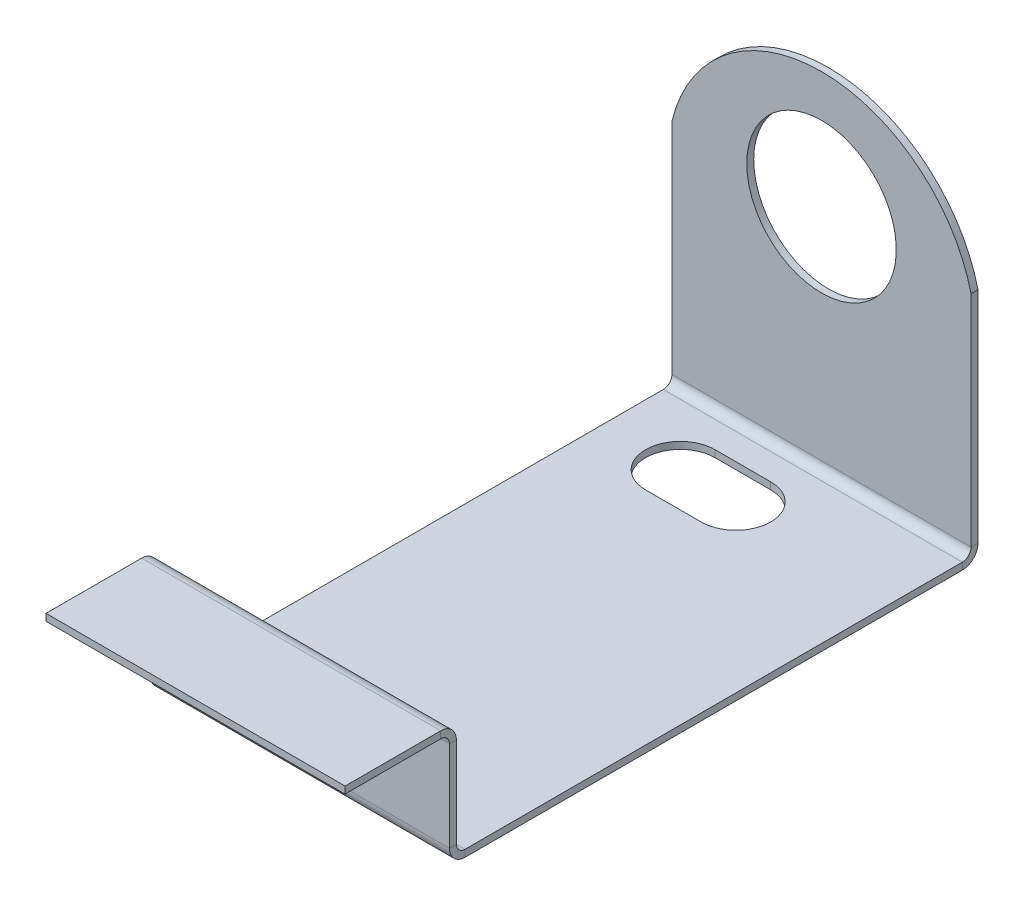
ISO-10303-21;
HEADER;
FILE_DESCRIPTION(('STEP AP214'),'2;1');
FILE_NAME('part.step','',(''),(''),'','','');
FILE_SCHEMA(('AUTOMOTIVE_DESIGN { 1 0 10303 214 1 1 1 1 }'));
ENDSEC;
DATA;
#1=APPLICATION_CONTEXT('core data for automotive mechanical design processes');
#2=APPLICATION_PROTOCOL_DEFINITION('international standard','automotive_design',2000,#1);
#3=PRODUCT_CONTEXT('',#1,'mechanical');
#4=PRODUCT('Part','Part','',(#3));
#5=PRODUCT_RELATED_PRODUCT_CATEGORY('part','',(#4));
#6=PRODUCT_DEFINITION_FORMATION('','',#4);
#7=PRODUCT_DEFINITION_CONTEXT('part definition',#1,'design');
#8=PRODUCT_DEFINITION('design','',#6,#7);
#9=PRODUCT_DEFINITION_SHAPE('','',#8);
#10=(LENGTH_UNIT() NAMED_UNIT(*) SI_UNIT(.MILLI.,.METRE.));
#11=(NAMED_UNIT(*) PLANE_ANGLE_UNIT() SI_UNIT($,.RADIAN.));
#12=(NAMED_UNIT(*) SI_UNIT($,.STERADIAN.) SOLID_ANGLE_UNIT());
#13=UNCERTAINTY_MEASURE_WITH_UNIT(LENGTH_MEASURE(1.E-05),#10,'distance_accuracy_value','');
#14=(GEOMETRIC_REPRESENTATION_CONTEXT(3) GLOBAL_UNCERTAINTY_ASSIGNED_CONTEXT((#13)) GLOBAL_UNIT_ASSIGNED_CONTEXT((#10,
#11,#12)) REPRESENTATION_CONTEXT('',''));
#15=CARTESIAN_POINT('',(0.,0.,0.));
#16=DIRECTION('',(0.,0.,1.));
#17=DIRECTION('',(1.,0.,0.));
#18=AXIS2_PLACEMENT_3D('',#15,#16,#17);
#19=CARTESIAN_POINT('',(86.,-148.497787143782,-31.9999999999995));
#20=DIRECTION('',(-1.,0.,0.));
#21=DIRECTION('',(0.,1.,0.));
#22=AXIS2_PLACEMENT_3D('',#19,#20,#21);
#23=PLANE('',#22);
#24=DIRECTION('',(0.,1.,0.));
#25=VECTOR('',#24,1.);
#26=CARTESIAN_POINT('',(86.,-148.497787143782,-31.9999999999995));
#27=LINE('',#26,#25);
#28=CARTESIAN_POINT('',(86.,2.49999999999999,-32.));
#29=VERTEX_POINT('',#28);
#30=CARTESIAN_POINT('',(86.,28.5000000000001,-32.0000000000001));
#31=VERTEX_POINT('',#30);
#32=EDGE_CURVE('E372',#29,#31,#27,.T.);
#33=ORIENTED_EDGE('',*,*,#32,.T.);
#34=DIRECTION('',(0.,0.,1.));
#35=VECTOR('',#34,1.);
#36=CARTESIAN_POINT('',(86.,28.5000000000001,-32.0000000000002));
#37=LINE('',#36,#35);
#38=CARTESIAN_POINT('',(86.,28.5,-30.0000000000001));
#39=VERTEX_POINT('',#38);
#40=EDGE_CURVE('E12',#31,#39,#37,.T.);
#41=ORIENTED_EDGE('',*,*,#40,.T.);
#42=DIRECTION('',(0.,1.,0.));
#43=VECTOR('',#42,1.);
#44=CARTESIAN_POINT('',(86.,-148.497787143782,-29.9999999999995));
#45=LINE('',#44,#43);
#46=CARTESIAN_POINT('',(86.,2.50000000000002,-30.));
#47=VERTEX_POINT('',#46);
#48=EDGE_CURVE('E271',#47,#39,#45,.T.);
#49=ORIENTED_EDGE('',*,*,#48,.F.);
#50=DIRECTION('',(0.,0.,1.));
#51=VECTOR('',#50,1.);
#52=CARTESIAN_POINT('',(86.,2.50000000000006,-32.0000000000001));
#53=LINE('',#52,#51);
#54=EDGE_CURVE('E355',#29,#47,#53,.T.);
#55=ORIENTED_EDGE('',*,*,#54,.F.);
#56=EDGE_LOOP('',(#33,#41,#49,#55));
#57=FACE_BOUND('',#56,.T.);
#58=ADVANCED_FACE('F37',(#57),#23,.F.);
#59=CARTESIAN_POINT('',(0.,-148.497787143782,-31.9999999999995));
#60=DIRECTION('',(0.,0.,1.));
#61=DIRECTION('',(0.,-1.,0.));
#62=AXIS2_PLACEMENT_3D('',#59,#60,#61);
#63=PLANE('',#62);
#64=DIRECTION('',(0.,1.,0.));
#65=VECTOR('',#64,1.);
#66=CARTESIAN_POINT('',(0.,-148.497787143782,-31.9999999999995));
#67=LINE('',#66,#65);
#68=CARTESIAN_POINT('',(0.,2.50000000000001,-32.));
#69=VERTEX_POINT('',#68);
#70=CARTESIAN_POINT('',(0.,28.5000000000001,-32.0000000000001));
#71=VERTEX_POINT('',#70);
#72=EDGE_CURVE('E40',#69,#71,#67,.T.);
#73=ORIENTED_EDGE('',*,*,#72,.T.);
#74=DIRECTION('',(1.,0.,0.));
#75=VECTOR('',#74,1.);
#76=CARTESIAN_POINT('',(0.,28.5000000000001,-32.0000000000001));
#77=LINE('',#76,#75);
#78=EDGE_CURVE('E365',#71,#31,#77,.T.);
#79=ORIENTED_EDGE('',*,*,#78,.T.);
#80=ORIENTED_EDGE('',*,*,#32,.F.);
#81=DIRECTION('',(1.,0.,0.));
#82=VECTOR('',#81,1.);
#83=CARTESIAN_POINT('',(0.,2.50000000000006,-32.));
#84=LINE('',#83,#82);
#85=EDGE_CURVE('E352',#69,#29,#84,.T.);
#86=ORIENTED_EDGE('',*,*,#85,.F.);
#87=EDGE_LOOP('',(#73,#79,#80,#86));
#88=FACE_BOUND('',#87,.T.);
#89=ADVANCED_FACE('F383',(#88),#63,.F.);
#90=CARTESIAN_POINT('',(0.,-148.497787143782,-29.9999999999995));
#91=DIRECTION('',(1.,0.,0.));
#92=DIRECTION('',(0.,-1.,0.));
#93=AXIS2_PLACEMENT_3D('',#90,#91,#92);
#94=PLANE('',#93);
#95=DIRECTION('',(0.,1.,0.));
#96=VECTOR('',#95,1.);
#97=CARTESIAN_POINT('',(0.,-148.497787143782,-29.9999999999995));
#98=LINE('',#97,#96);
#99=CARTESIAN_POINT('',(0.,2.50000000000002,-30.));
#100=VERTEX_POINT('',#99);
#101=CARTESIAN_POINT('',(0.,28.5000000000001,-30.0000000000001));
#102=VERTEX_POINT('',#101);
#103=EDGE_CURVE('E356',#100,#102,#98,.T.);
#104=ORIENTED_EDGE('',*,*,#103,.T.);
#105=DIRECTION('',(0.,0.,-1.));
#106=VECTOR('',#105,1.);
#107=CARTESIAN_POINT('',(0.,28.5000000000001,-30.0000000000002));
#108=LINE('',#107,#106);
#109=EDGE_CURVE('E368',#102,#71,#108,.T.);
#110=ORIENTED_EDGE('',*,*,#109,.T.);
#111=ORIENTED_EDGE('',*,*,#72,.F.);
#112=DIRECTION('',(0.,0.,-1.));
#113=VECTOR('',#112,1.);
#114=CARTESIAN_POINT('',(0.,2.50000000000007,-30.0000000000001));
#115=LINE('',#114,#113);
#116=EDGE_CURVE('E362',#100,#69,#115,.T.);
#117=ORIENTED_EDGE('',*,*,#116,.F.);
#118=EDGE_LOOP('',(#104,#110,#111,#117));
#119=FACE_BOUND('',#118,.T.);
#120=ADVANCED_FACE('F386',(#119),#94,.F.);
#121=CARTESIAN_POINT('',(0.,-148.497787143782,-29.9999999999995));
#122=DIRECTION('',(0.,0.,1.));
#123=DIRECTION('',(0.,-1.,0.));
#124=AXIS2_PLACEMENT_3D('',#121,#122,#123);
#125=PLANE('',#124);
#126=DIRECTION('',(1.,0.,0.));
#127=VECTOR('',#126,1.);
#128=CARTESIAN_POINT('',(0.,28.5000000000001,-30.0000000000001));
#129=LINE('',#128,#127);
#130=EDGE_CURVE('E45',#102,#39,#129,.T.);
#131=ORIENTED_EDGE('',*,*,#130,.F.);
#132=ORIENTED_EDGE('',*,*,#103,.F.);
#133=DIRECTION('',(1.,0.,0.));
#134=VECTOR('',#133,1.);
#135=CARTESIAN_POINT('',(0.,2.50000000000007,-30.));
#136=LINE('',#135,#134);
#137=EDGE_CURVE('E359',#100,#47,#136,.T.);
#138=ORIENTED_EDGE('',*,*,#137,.T.);
#139=ORIENTED_EDGE('',*,*,#48,.T.);
#140=EDGE_LOOP('',(#131,#132,#138,#139));
#141=FACE_BOUND('',#140,.T.);
#142=ADVANCED_FACE('F454',(#141),#125,.T.);
#143=CARTESIAN_POINT('',(43.,55.1788366009013,-180.));
#144=DIRECTION('',(0.,0.,-1.));
#145=DIRECTION('',(-1.,0.,0.));
#146=AXIS2_PLACEMENT_3D('',#143,#144,#145);
#147=CYLINDRICAL_SURFACE('',#146,44.2489583618449);
#148=DIRECTION('',(0.,0.,1.));
#149=VECTOR('',#148,1.);
#150=CARTESIAN_POINT('',(0.,65.6177214124262,-180.));
#151=LINE('',#150,#149);
#152=CARTESIAN_POINT('',(0.,65.6177214124262,-180.));
#153=VERTEX_POINT('',#152);
#154=CARTESIAN_POINT('',(0.,65.6177214124262,-182.));
#155=VERTEX_POINT('',#154);
#156=EDGE_CURVE('E341',#153,#155,#151,.F.);
#157=ORIENTED_EDGE('',*,*,#156,.F.);
#158=CARTESIAN_POINT('',(43.,55.1788366009013,-180.));
#159=DIRECTION('',(0.,0.,-1.));
#160=DIRECTION('',(-1.,0.,0.));
#161=AXIS2_PLACEMENT_3D('',#158,#159,#160);
#162=CIRCLE('',#161,44.2489583618449);
#163=CARTESIAN_POINT('',(86.,65.6177214124262,-180.));
#164=VERTEX_POINT('',#163);
#165=EDGE_CURVE('E324',#164,#153,#162,.F.);
#166=ORIENTED_EDGE('',*,*,#165,.F.);
#167=DIRECTION('',(0.,0.,1.));
#168=VECTOR('',#167,1.);
#169=CARTESIAN_POINT('',(86.,65.6177214124262,-180.));
#170=LINE('',#169,#168);
#171=CARTESIAN_POINT('',(86.,65.6177214124262,-182.));
#172=VERTEX_POINT('',#171);
#173=EDGE_CURVE('E349',#164,#172,#170,.F.);
#174=ORIENTED_EDGE('',*,*,#173,.T.);
#175=CARTESIAN_POINT('',(43.,55.1788366009013,-182.));
#176=DIRECTION('',(0.,0.,-1.));
#177=DIRECTION('',(-1.,0.,0.));
#178=AXIS2_PLACEMENT_3D('',#175,#176,#177);
#179=CIRCLE('',#178,44.2489583618449);
#180=EDGE_CURVE('E347',#172,#155,#179,.F.);
#181=ORIENTED_EDGE('',*,*,#180,.T.);
#182=EDGE_LOOP('',(#157,#166,#174,#181));
#183=FACE_BOUND('',#182,.T.);
#184=ADVANCED_FACE('F456',(#183),#147,.T.);
#185=CARTESIAN_POINT('',(43.0084201572259,65.7834199573394,-172.));
#186=DIRECTION('',(0.,0.,-1.));
#187=DIRECTION('',(-1.,0.,0.));
#188=AXIS2_PLACEMENT_3D('',#185,#186,#187);
#189=CYLINDRICAL_SURFACE('',#188,21.5);
#190=CARTESIAN_POINT('',(43.0084201572259,65.7834199573394,-182.));
#191=DIRECTION('',(0.,0.,-1.));
#192=DIRECTION('',(-1.,0.,0.));
#193=AXIS2_PLACEMENT_3D('',#190,#191,#192);
#194=CIRCLE('',#193,21.5);
#195=CARTESIAN_POINT('',(21.5084201572259,65.7834199573394,-182.));
#196=VERTEX_POINT('',#195);
#197=EDGE_CURVE('E344',#196,#196,#194,.T.);
#198=ORIENTED_EDGE('',*,*,#197,.T.);
#199=EDGE_LOOP('',(#198));
#200=FACE_BOUND('',#199,.T.);
#201=CARTESIAN_POINT('',(43.0084201572259,65.7834199573394,-180.));
#202=DIRECTION('',(0.,0.,-1.));
#203=DIRECTION('',(-1.,0.,0.));
#204=AXIS2_PLACEMENT_3D('',#201,#202,#203);
#205=CIRCLE('',#204,21.5);
#206=CARTESIAN_POINT('',(21.5084201572259,65.7834199573394,-180.));
#207=VERTEX_POINT('',#206);
#208=EDGE_CURVE('E327',#207,#207,#205,.T.);
#209=ORIENTED_EDGE('',*,*,#208,.F.);
#210=EDGE_LOOP('',(#209));
#211=FACE_BOUND('',#210,.T.);
#212=ADVANCED_FACE('F461',(#200,#211),#189,.F.);
#213=CARTESIAN_POINT('',(0.,0.,-182.));
#214=DIRECTION('',(-1.,0.,0.));
#215=DIRECTION('',(0.,0.,1.));
#216=AXIS2_PLACEMENT_3D('',#213,#214,#215);
#217=PLANE('',#216);
#218=DIRECTION('',(0.,-1.,0.));
#219=VECTOR('',#218,1.);
#220=CARTESIAN_POINT('',(0.,0.,-180.));
#221=LINE('',#220,#219);
#222=CARTESIAN_POINT('',(0.,2.49999999999998,-180.));
#223=VERTEX_POINT('',#222);
#224=EDGE_CURVE('E322',#153,#223,#221,.T.);
#225=ORIENTED_EDGE('',*,*,#224,.F.);
#226=ORIENTED_EDGE('',*,*,#156,.T.);
#227=DIRECTION('',(0.,-1.,0.));
#228=VECTOR('',#227,1.);
#229=CARTESIAN_POINT('',(0.,0.,-182.));
#230=LINE('',#229,#228);
#231=CARTESIAN_POINT('',(0.,2.50000000000002,-182.));
#232=VERTEX_POINT('',#231);
#233=EDGE_CURVE('E339',#155,#232,#230,.T.);
#234=ORIENTED_EDGE('',*,*,#233,.T.);
#235=DIRECTION('',(0.,0.,-1.));
#236=VECTOR('',#235,1.);
#237=CARTESIAN_POINT('',(0.,2.5,-180.));
#238=LINE('',#237,#236);
#239=EDGE_CURVE('E316',#223,#232,#238,.T.);
#240=ORIENTED_EDGE('',*,*,#239,.F.);
#241=EDGE_LOOP('',(#225,#226,#234,#240));
#242=FACE_BOUND('',#241,.T.);
#243=ADVANCED_FACE('F502',(#242),#217,.T.);
#244=CARTESIAN_POINT('',(0.,0.,-182.));
#245=DIRECTION('',(0.,0.,-1.));
#246=DIRECTION('',(-1.,0.,0.));
#247=AXIS2_PLACEMENT_3D('',#244,#245,#246);
#248=PLANE('',#247);
#249=ORIENTED_EDGE('',*,*,#197,.F.);
#250=EDGE_LOOP('',(#249));
#251=FACE_BOUND('',#250,.T.);
#252=ORIENTED_EDGE('',*,*,#233,.F.);
#253=ORIENTED_EDGE('',*,*,#180,.F.);
#254=DIRECTION('',(0.,1.,0.));
#255=VECTOR('',#254,1.);
#256=CARTESIAN_POINT('',(86.,100.,-182.));
#257=LINE('',#256,#255);
#258=CARTESIAN_POINT('',(86.,2.49999999999998,-182.));
#259=VERTEX_POINT('',#258);
#260=EDGE_CURVE('E333',#259,#172,#257,.T.);
#261=ORIENTED_EDGE('',*,*,#260,.F.);
#262=DIRECTION('',(-1.,0.,0.));
#263=VECTOR('',#262,1.);
#264=CARTESIAN_POINT('',(0.,2.50000000000002,-182.));
#265=LINE('',#264,#263);
#266=EDGE_CURVE('E336',#259,#232,#265,.T.);
#267=ORIENTED_EDGE('',*,*,#266,.T.);
#268=EDGE_LOOP('',(#252,#253,#261,#267));
#269=FACE_BOUND('',#268,.T.);
#270=ADVANCED_FACE('F498',(#251,#269),#248,.T.);
#271=CARTESIAN_POINT('',(86.,100.,-182.));
#272=DIRECTION('',(1.,0.,0.));
#273=DIRECTION('',(0.,0.,-1.));
#274=AXIS2_PLACEMENT_3D('',#271,#272,#273);
#275=PLANE('',#274);
#276=ORIENTED_EDGE('',*,*,#260,.T.);
#277=ORIENTED_EDGE('',*,*,#173,.F.);
#278=DIRECTION('',(0.,1.,0.));
#279=VECTOR('',#278,1.);
#280=CARTESIAN_POINT('',(86.,100.,-180.));
#281=LINE('',#280,#279);
#282=CARTESIAN_POINT('',(86.,2.49999999999998,-180.));
#283=VERTEX_POINT('',#282);
#284=EDGE_CURVE('E319',#283,#164,#281,.T.);
#285=ORIENTED_EDGE('',*,*,#284,.F.);
#286=DIRECTION('',(0.,0.,-1.));
#287=VECTOR('',#286,1.);
#288=CARTESIAN_POINT('',(86.,2.5,-180.));
#289=LINE('',#288,#287);
#290=EDGE_CURVE('E330',#283,#259,#289,.T.);
#291=ORIENTED_EDGE('',*,*,#290,.T.);
#292=EDGE_LOOP('',(#276,#277,#285,#291));
#293=FACE_BOUND('',#292,.T.);
#294=ADVANCED_FACE('F494',(#293),#275,.T.);
#295=CARTESIAN_POINT('',(0.,0.,-180.));
#296=DIRECTION('',(0.,0.,-1.));
#297=DIRECTION('',(-1.,0.,0.));
#298=AXIS2_PLACEMENT_3D('',#295,#296,#297);
#299=PLANE('',#298);
#300=ORIENTED_EDGE('',*,*,#208,.T.);
#301=EDGE_LOOP('',(#300));
#302=FACE_BOUND('',#301,.T.);
#303=ORIENTED_EDGE('',*,*,#165,.T.);
#304=ORIENTED_EDGE('',*,*,#224,.T.);
#305=DIRECTION('',(-1.,0.,0.));
#306=VECTOR('',#305,1.);
#307=CARTESIAN_POINT('',(86.,2.5,-180.));
#308=LINE('',#307,#306);
#309=EDGE_CURVE('E299',#283,#223,#308,.T.);
#310=ORIENTED_EDGE('',*,*,#309,.F.);
#311=ORIENTED_EDGE('',*,*,#284,.T.);
#312=EDGE_LOOP('',(#303,#304,#310,#311));
#313=FACE_BOUND('',#312,.T.);
#314=ADVANCED_FACE('F490',(#302,#313),#299,.F.);
#315=CARTESIAN_POINT('',(0.,2.49999999999998,-177.5));
#316=DIRECTION('',(1.,0.,0.));
#317=DIRECTION('',(0.,0.,-1.));
#318=AXIS2_PLACEMENT_3D('',#315,#316,#317);
#319=PLANE('',#318);
#320=CARTESIAN_POINT('',(0.,2.49999999999998,-177.5));
#321=DIRECTION('',(-1.,0.,0.));
#322=DIRECTION('',(0.,0.,1.));
#323=AXIS2_PLACEMENT_3D('',#320,#321,#322);
#324=CIRCLE('',#323,2.5);
#325=CARTESIAN_POINT('',(0.,0.,-177.5));
#326=VERTEX_POINT('',#325);
#327=EDGE_CURVE('E296',#223,#326,#324,.T.);
#328=ORIENTED_EDGE('',*,*,#327,.F.);
#329=ORIENTED_EDGE('',*,*,#239,.T.);
#330=CARTESIAN_POINT('',(0.,2.49999999999998,-177.5));
#331=DIRECTION('',(-1.,0.,0.));
#332=DIRECTION('',(0.,0.,1.));
#333=AXIS2_PLACEMENT_3D('',#330,#331,#332);
#334=CIRCLE('',#333,4.5);
#335=CARTESIAN_POINT('',(0.,-2.00000000000002,-177.5));
#336=VERTEX_POINT('',#335);
#337=EDGE_CURVE('E313',#232,#336,#334,.T.);
#338=ORIENTED_EDGE('',*,*,#337,.T.);
#339=DIRECTION('',(0.,-1.,0.));
#340=VECTOR('',#339,1.);
#341=CARTESIAN_POINT('',(0.,0.,-177.5));
#342=LINE('',#341,#340);
#343=EDGE_CURVE('E268',#326,#336,#342,.T.);
#344=ORIENTED_EDGE('',*,*,#343,.F.);
#345=EDGE_LOOP('',(#328,#329,#338,#344));
#346=FACE_BOUND('',#345,.T.);
#347=ADVANCED_FACE('F486',(#346),#319,.F.);
#348=CARTESIAN_POINT('',(0.,2.49999999999998,-177.5));
#349=DIRECTION('',(-1.,0.,0.));
#350=DIRECTION('',(0.,0.,-1.));
#351=AXIS2_PLACEMENT_3D('',#348,#349,#350);
#352=CYLINDRICAL_SURFACE('',#351,4.5);
#353=DIRECTION('',(-1.,0.,0.));
#354=VECTOR('',#353,1.);
#355=CARTESIAN_POINT('',(0.,-2.00000000000002,-177.5));
#356=LINE('',#355,#354);
#357=CARTESIAN_POINT('',(86.,-2.,-177.5));
#358=VERTEX_POINT('',#357);
#359=EDGE_CURVE('E281',#336,#358,#356,.F.);
#360=ORIENTED_EDGE('',*,*,#359,.F.);
#361=ORIENTED_EDGE('',*,*,#337,.F.);
#362=ORIENTED_EDGE('',*,*,#266,.F.);
#363=CARTESIAN_POINT('',(86.,2.49999999999998,-177.5));
#364=DIRECTION('',(-1.,0.,0.));
#365=DIRECTION('',(0.,0.,1.));
#366=AXIS2_PLACEMENT_3D('',#363,#364,#365);
#367=CIRCLE('',#366,4.5);
#368=EDGE_CURVE('E307',#358,#259,#367,.F.);
#369=ORIENTED_EDGE('',*,*,#368,.F.);
#370=EDGE_LOOP('',(#360,#361,#362,#369));
#371=FACE_BOUND('',#370,.T.);
#372=ADVANCED_FACE('F482',(#371),#352,.T.);
#373=CARTESIAN_POINT('',(86.,2.49999999999998,-177.5));
#374=DIRECTION('',(1.,0.,0.));
#375=DIRECTION('',(0.,0.,-1.));
#376=AXIS2_PLACEMENT_3D('',#373,#374,#375);
#377=PLANE('',#376);
#378=ORIENTED_EDGE('',*,*,#290,.F.);
#379=CARTESIAN_POINT('',(86.,2.49999999999998,-177.5));
#380=DIRECTION('',(-1.,0.,0.));
#381=DIRECTION('',(0.,0.,1.));
#382=AXIS2_PLACEMENT_3D('',#379,#380,#381);
#383=CIRCLE('',#382,2.5);
#384=CARTESIAN_POINT('',(86.,0.,-177.5));
#385=VERTEX_POINT('',#384);
#386=EDGE_CURVE('E302',#385,#283,#383,.F.);
#387=ORIENTED_EDGE('',*,*,#386,.F.);
#388=DIRECTION('',(0.,-1.,0.));
#389=VECTOR('',#388,1.);
#390=CARTESIAN_POINT('',(86.,0.,-177.5));
#391=LINE('',#390,#389);
#392=EDGE_CURVE('E310',#385,#358,#391,.T.);
#393=ORIENTED_EDGE('',*,*,#392,.T.);
#394=ORIENTED_EDGE('',*,*,#368,.T.);
#395=EDGE_LOOP('',(#378,#387,#393,#394));
#396=FACE_BOUND('',#395,.T.);
#397=ADVANCED_FACE('F478',(#396),#377,.T.);
#398=CARTESIAN_POINT('',(0.,2.49999999999998,-177.5));
#399=DIRECTION('',(-1.,0.,0.));
#400=DIRECTION('',(0.,0.,-1.));
#401=AXIS2_PLACEMENT_3D('',#398,#399,#400);
#402=CYLINDRICAL_SURFACE('',#401,2.5);
#403=DIRECTION('',(-1.,0.,0.));
#404=VECTOR('',#403,1.);
#405=CARTESIAN_POINT('',(0.,0.,-177.5));
#406=LINE('',#405,#404);
#407=EDGE_CURVE('E305',#326,#385,#406,.F.);
#408=ORIENTED_EDGE('',*,*,#407,.T.);
#409=ORIENTED_EDGE('',*,*,#386,.T.);
#410=ORIENTED_EDGE('',*,*,#309,.T.);
#411=ORIENTED_EDGE('',*,*,#327,.T.);
#412=EDGE_LOOP('',(#408,#409,#410,#411));
#413=FACE_BOUND('',#412,.T.);
#414=ADVANCED_FACE('F474',(#413),#402,.F.);
#415=CARTESIAN_POINT('',(0.,0.,-180.));
#416=DIRECTION('',(0.,-1.,0.));
#417=DIRECTION('',(0.,0.,-1.));
#418=AXIS2_PLACEMENT_3D('',#415,#416,#417);
#419=PLANE('',#418);
#420=DIRECTION('',(1.,0.,0.));
#421=VECTOR('',#420,1.);
#422=CARTESIAN_POINT('',(22.4430676485823,0.,-149.95179193926));
#423=LINE('',#422,#421);
#424=CARTESIAN_POINT('',(22.4430676485823,0.,-149.95179193926));
#425=VERTEX_POINT('',#424);
#426=CARTESIAN_POINT('',(38.4430676485823,0.,-149.95179193926));
#427=VERTEX_POINT('',#426);
#428=EDGE_CURVE('E202',#425,#427,#423,.T.);
#429=ORIENTED_EDGE('',*,*,#428,.F.);
#430=CARTESIAN_POINT('',(22.4430676485823,0.,-159.95179193926));
#431=DIRECTION('',(0.,1.,0.));
#432=DIRECTION('',(0.,0.,1.));
#433=AXIS2_PLACEMENT_3D('',#430,#431,#432);
#434=CIRCLE('',#433,10.);
#435=CARTESIAN_POINT('',(22.4430676485823,0.,-169.95179193926));
#436=VERTEX_POINT('',#435);
#437=EDGE_CURVE('E53',#436,#425,#434,.T.);
#438=ORIENTED_EDGE('',*,*,#437,.F.);
#439=DIRECTION('',(-1.,0.,0.));
#440=VECTOR('',#439,1.);
#441=CARTESIAN_POINT('',(22.4430676485823,0.,-169.95179193926));
#442=LINE('',#441,#440);
#443=CARTESIAN_POINT('',(38.4430676485823,0.,-169.95179193926));
#444=VERTEX_POINT('',#443);
#445=EDGE_CURVE('E193',#444,#436,#442,.T.);
#446=ORIENTED_EDGE('',*,*,#445,.F.);
#447=CARTESIAN_POINT('',(38.4430676485823,0.,-159.95179193926));
#448=DIRECTION('',(0.,1.,0.));
#449=DIRECTION('',(0.,0.,-1.));
#450=AXIS2_PLACEMENT_3D('',#447,#448,#449);
#451=CIRCLE('',#450,10.);
#452=EDGE_CURVE('E196',#427,#444,#451,.T.);
#453=ORIENTED_EDGE('',*,*,#452,.F.);
#454=EDGE_LOOP('',(#429,#438,#446,#453));
#455=FACE_BOUND('',#454,.T.);
#456=DIRECTION('',(0.,0.,1.));
#457=VECTOR('',#456,1.);
#458=CARTESIAN_POINT('',(0.,0.,-180.));
#459=LINE('',#458,#457);
#460=CARTESIAN_POINT('',(0.,0.,-34.5));
#461=VERTEX_POINT('',#460);
#462=EDGE_CURVE('E293',#326,#461,#459,.T.);
#463=ORIENTED_EDGE('',*,*,#462,.T.);
#464=DIRECTION('',(1.,0.,0.));
#465=VECTOR('',#464,1.);
#466=CARTESIAN_POINT('',(0.,0.,-34.5));
#467=LINE('',#466,#465);
#468=CARTESIAN_POINT('',(86.,0.,-34.5));
#469=VERTEX_POINT('',#468);
#470=EDGE_CURVE('E290',#461,#469,#467,.T.);
#471=ORIENTED_EDGE('',*,*,#470,.T.);
#472=DIRECTION('',(0.,0.,1.));
#473=VECTOR('',#472,1.);
#474=CARTESIAN_POINT('',(86.,0.,-180.));
#475=LINE('',#474,#473);
#476=EDGE_CURVE('E287',#385,#469,#475,.T.);
#477=ORIENTED_EDGE('',*,*,#476,.F.);
#478=ORIENTED_EDGE('',*,*,#407,.F.);
#479=EDGE_LOOP('',(#463,#471,#477,#478));
#480=FACE_BOUND('',#479,.T.);
#481=ADVANCED_FACE('F441',(#455,#480),#419,.F.);
#482=CARTESIAN_POINT('',(86.,0.,-180.));
#483=DIRECTION('',(-1.,0.,0.));
#484=DIRECTION('',(0.,0.,1.));
#485=AXIS2_PLACEMENT_3D('',#482,#483,#484);
#486=PLANE('',#485);
#487=ORIENTED_EDGE('',*,*,#476,.T.);
#488=DIRECTION('',(0.,-1.,0.));
#489=VECTOR('',#488,1.);
#490=CARTESIAN_POINT('',(86.,0.,-34.5));
#491=LINE('',#490,#489);
#492=CARTESIAN_POINT('',(86.,-2.,-34.5));
#493=VERTEX_POINT('',#492);
#494=EDGE_CURVE('E284',#469,#493,#491,.T.);
#495=ORIENTED_EDGE('',*,*,#494,.T.);
#496=DIRECTION('',(0.,0.,1.));
#497=VECTOR('',#496,1.);
#498=CARTESIAN_POINT('',(86.,-2.,-180.));
#499=LINE('',#498,#497);
#500=EDGE_CURVE('E278',#358,#493,#499,.T.);
#501=ORIENTED_EDGE('',*,*,#500,.F.);
#502=ORIENTED_EDGE('',*,*,#392,.F.);
#503=EDGE_LOOP('',(#487,#495,#501,#502));
#504=FACE_BOUND('',#503,.T.);
#505=ADVANCED_FACE('F436',(#504),#486,.F.);
#506=CARTESIAN_POINT('',(0.,-2.,-180.));
#507=DIRECTION('',(0.,-1.,0.));
#508=DIRECTION('',(0.,0.,-1.));
#509=AXIS2_PLACEMENT_3D('',#506,#507,#508);
#510=PLANE('',#509);
#511=CARTESIAN_POINT('',(22.4430676485823,-2.00000000000002,-159.95179193926));
#512=DIRECTION('',(0.,1.,0.));
#513=DIRECTION('',(0.,0.,1.));
#514=AXIS2_PLACEMENT_3D('',#511,#512,#513);
#515=CIRCLE('',#514,10.);
#516=CARTESIAN_POINT('',(22.4430676485823,-2.00000000000002,-169.95179193926));
#517=VERTEX_POINT('',#516);
#518=CARTESIAN_POINT('',(22.4430676485823,-2.00000000000002,-149.95179193926));
#519=VERTEX_POINT('',#518);
#520=EDGE_CURVE('E177',#517,#519,#515,.T.);
#521=ORIENTED_EDGE('',*,*,#520,.T.);
#522=DIRECTION('',(1.,0.,0.));
#523=VECTOR('',#522,1.);
#524=CARTESIAN_POINT('',(22.4430676485823,-2.00000000000002,-149.95179193926));
#525=LINE('',#524,#523);
#526=CARTESIAN_POINT('',(38.4430676485823,-2.,-149.95179193926));
#527=VERTEX_POINT('',#526);
#528=EDGE_CURVE('E186',#519,#527,#525,.T.);
#529=ORIENTED_EDGE('',*,*,#528,.T.);
#530=CARTESIAN_POINT('',(38.4430676485823,-2.00000000000002,-159.95179193926));
#531=DIRECTION('',(0.,1.,0.));
#532=DIRECTION('',(0.,0.,-1.));
#533=AXIS2_PLACEMENT_3D('',#530,#531,#532);
#534=CIRCLE('',#533,10.);
#535=CARTESIAN_POINT('',(38.4430676485823,-2.00000000000002,-169.95179193926));
#536=VERTEX_POINT('',#535);
#537=EDGE_CURVE('E61',#527,#536,#534,.T.);
#538=ORIENTED_EDGE('',*,*,#537,.T.);
#539=DIRECTION('',(-1.,0.,0.));
#540=VECTOR('',#539,1.);
#541=CARTESIAN_POINT('',(22.4430676485823,-2.00000000000002,-169.95179193926));
#542=LINE('',#541,#540);
#543=EDGE_CURVE('E183',#536,#517,#542,.T.);
#544=ORIENTED_EDGE('',*,*,#543,.T.);
#545=EDGE_LOOP('',(#521,#529,#538,#544));
#546=FACE_BOUND('',#545,.T.);
#547=DIRECTION('',(1.,0.,0.));
#548=VECTOR('',#547,1.);
#549=CARTESIAN_POINT('',(0.,-2.,-34.5));
#550=LINE('',#549,#548);
#551=CARTESIAN_POINT('',(0.,-2.,-34.5000000000001));
#552=VERTEX_POINT('',#551);
#553=EDGE_CURVE('E263',#552,#493,#550,.T.);
#554=ORIENTED_EDGE('',*,*,#553,.F.);
#555=DIRECTION('',(0.,0.,1.));
#556=VECTOR('',#555,1.);
#557=CARTESIAN_POINT('',(0.,-2.,-180.));
#558=LINE('',#557,#556);
#559=EDGE_CURVE('E275',#336,#552,#558,.T.);
#560=ORIENTED_EDGE('',*,*,#559,.F.);
#561=ORIENTED_EDGE('',*,*,#359,.T.);
#562=ORIENTED_EDGE('',*,*,#500,.T.);
#563=EDGE_LOOP('',(#554,#560,#561,#562));
#564=FACE_BOUND('',#563,.T.);
#565=ADVANCED_FACE('F190',(#546,#564),#510,.T.);
#566=CARTESIAN_POINT('',(0.,-2.,-180.));
#567=DIRECTION('',(1.,0.,0.));
#568=DIRECTION('',(0.,0.,-1.));
#569=AXIS2_PLACEMENT_3D('',#566,#567,#568);
#570=PLANE('',#569);
#571=ORIENTED_EDGE('',*,*,#559,.T.);
#572=DIRECTION('',(0.,1.,0.));
#573=VECTOR('',#572,1.);
#574=CARTESIAN_POINT('',(0.,-1.99999999999999,-34.5));
#575=LINE('',#574,#573);
#576=EDGE_CURVE('E272',#552,#461,#575,.T.);
#577=ORIENTED_EDGE('',*,*,#576,.T.);
#578=ORIENTED_EDGE('',*,*,#462,.F.);
#579=ORIENTED_EDGE('',*,*,#343,.T.);
#580=EDGE_LOOP('',(#571,#577,#578,#579));
#581=FACE_BOUND('',#580,.T.);
#582=ADVANCED_FACE('F444',(#581),#570,.F.);
#583=CARTESIAN_POINT('',(0.,2.5,-34.5));
#584=DIRECTION('',(1.,0.,0.));
#585=DIRECTION('',(0.,0.,-1.));
#586=AXIS2_PLACEMENT_3D('',#583,#584,#585);
#587=PLANE('',#586);
#588=ORIENTED_EDGE('',*,*,#576,.F.);
#589=CARTESIAN_POINT('',(0.,2.5,-34.5));
#590=DIRECTION('',(1.,0.,0.));
#591=DIRECTION('',(0.,0.,-1.));
#592=AXIS2_PLACEMENT_3D('',#589,#590,#591);
#593=CIRCLE('',#592,4.5);
#594=EDGE_CURVE('E251',#552,#100,#593,.F.);
#595=ORIENTED_EDGE('',*,*,#594,.T.);
#596=ORIENTED_EDGE('',*,*,#116,.T.);
#597=CARTESIAN_POINT('',(0.,2.5,-34.5));
#598=DIRECTION('',(-1.,0.,0.));
#599=DIRECTION('',(0.,0.,1.));
#600=AXIS2_PLACEMENT_3D('',#597,#598,#599);
#601=CIRCLE('',#600,2.5);
#602=EDGE_CURVE('E256',#461,#69,#601,.T.);
#603=ORIENTED_EDGE('',*,*,#602,.F.);
#604=EDGE_LOOP('',(#588,#595,#596,#603));
#605=FACE_BOUND('',#604,.T.);
#606=ADVANCED_FACE('F449',(#605),#587,.F.);
#607=CARTESIAN_POINT('',(86.,2.5,-34.5));
#608=DIRECTION('',(-1.,0.,0.));
#609=DIRECTION('',(0.,0.,1.));
#610=AXIS2_PLACEMENT_3D('',#607,#608,#609);
#611=PLANE('',#610);
#612=ORIENTED_EDGE('',*,*,#54,.T.);
#613=CARTESIAN_POINT('',(86.,2.5,-34.5));
#614=DIRECTION('',(1.,0.,0.));
#615=DIRECTION('',(0.,0.,-1.));
#616=AXIS2_PLACEMENT_3D('',#613,#614,#615);
#617=CIRCLE('',#616,4.5);
#618=EDGE_CURVE('E260',#47,#493,#617,.T.);
#619=ORIENTED_EDGE('',*,*,#618,.T.);
#620=ORIENTED_EDGE('',*,*,#494,.F.);
#621=CARTESIAN_POINT('',(86.,2.5,-34.5));
#622=DIRECTION('',(1.,0.,0.));
#623=DIRECTION('',(0.,0.,1.));
#624=AXIS2_PLACEMENT_3D('',#621,#622,#623);
#625=CIRCLE('',#624,2.5);
#626=EDGE_CURVE('E259',#29,#469,#625,.T.);
#627=ORIENTED_EDGE('',*,*,#626,.F.);
#628=EDGE_LOOP('',(#612,#619,#620,#627));
#629=FACE_BOUND('',#628,.T.);
#630=ADVANCED_FACE('F432',(#629),#611,.F.);
#631=CARTESIAN_POINT('',(-43.1987567397485,2.5,-34.5));
#632=DIRECTION('',(1.,0.,0.));
#633=DIRECTION('',(0.,0.,-1.));
#634=AXIS2_PLACEMENT_3D('',#631,#632,#633);
#635=CYLINDRICAL_SURFACE('',#634,2.5);
#636=ORIENTED_EDGE('',*,*,#626,.T.);
#637=ORIENTED_EDGE('',*,*,#470,.F.);
#638=ORIENTED_EDGE('',*,*,#602,.T.);
#639=ORIENTED_EDGE('',*,*,#85,.T.);
#640=EDGE_LOOP('',(#636,#637,#638,#639));
#641=FACE_BOUND('',#640,.T.);
#642=ADVANCED_FACE('F429',(#641),#635,.F.);
#643=CARTESIAN_POINT('',(-43.1987567397485,2.5,-34.5));
#644=DIRECTION('',(1.,0.,0.));
#645=DIRECTION('',(0.,0.,-1.));
#646=AXIS2_PLACEMENT_3D('',#643,#644,#645);
#647=CYLINDRICAL_SURFACE('',#646,4.5);
#648=ORIENTED_EDGE('',*,*,#618,.F.);
#649=ORIENTED_EDGE('',*,*,#137,.F.);
#650=ORIENTED_EDGE('',*,*,#594,.F.);
#651=ORIENTED_EDGE('',*,*,#553,.T.);
#652=EDGE_LOOP('',(#648,#649,#650,#651));
#653=FACE_BOUND('',#652,.T.);
#654=ADVANCED_FACE('F452',(#653),#647,.T.);
#655=CARTESIAN_POINT('',(0.,28.5000000000001,-27.5000000000001));
#656=DIRECTION('',(-1.,0.,0.));
#657=DIRECTION('',(0.,0.,1.));
#658=AXIS2_PLACEMENT_3D('',#655,#656,#657);
#659=PLANE('',#658);
#660=ORIENTED_EDGE('',*,*,#109,.F.);
#661=CARTESIAN_POINT('',(0.,28.5000000000001,-27.5000000000001));
#662=DIRECTION('',(1.,0.,0.));
#663=DIRECTION('',(0.,0.,-1.));
#664=AXIS2_PLACEMENT_3D('',#661,#662,#663);
#665=CIRCLE('',#664,2.5);
#666=CARTESIAN_POINT('',(0.,31.,-27.5000000000001));
#667=VERTEX_POINT('',#666);
#668=EDGE_CURVE('E215',#102,#667,#665,.T.);
#669=ORIENTED_EDGE('',*,*,#668,.T.);
#670=DIRECTION('',(0.,1.,0.));
#671=VECTOR('',#670,1.);
#672=CARTESIAN_POINT('',(0.,31.,-27.5000000000001));
#673=LINE('',#672,#671);
#674=CARTESIAN_POINT('',(0.,33.,-27.5000000000001));
#675=VERTEX_POINT('',#674);
#676=EDGE_CURVE('E236',#667,#675,#673,.T.);
#677=ORIENTED_EDGE('',*,*,#676,.T.);
#678=CARTESIAN_POINT('',(0.,28.5000000000001,-27.5000000000001));
#679=DIRECTION('',(1.,0.,0.));
#680=DIRECTION('',(0.,0.,-1.));
#681=AXIS2_PLACEMENT_3D('',#678,#679,#680);
#682=CIRCLE('',#681,4.5);
#683=EDGE_CURVE('E244',#71,#675,#682,.T.);
#684=ORIENTED_EDGE('',*,*,#683,.F.);
#685=EDGE_LOOP('',(#660,#669,#677,#684));
#686=FACE_BOUND('',#685,.T.);
#687=ADVANCED_FACE('F389',(#686),#659,.T.);
#688=CARTESIAN_POINT('',(86.,28.5000000000001,-27.5000000000001));
#689=DIRECTION('',(1.,0.,0.));
#690=DIRECTION('',(0.,0.,-1.));
#691=AXIS2_PLACEMENT_3D('',#688,#689,#690);
#692=PLANE('',#691);
#693=DIRECTION('',(0.,-1.,0.));
#694=VECTOR('',#693,1.);
#695=CARTESIAN_POINT('',(86.,33.,-27.5000000000001));
#696=LINE('',#695,#694);
#697=CARTESIAN_POINT('',(86.,33.0000000000001,-27.5000000000002));
#698=VERTEX_POINT('',#697);
#699=CARTESIAN_POINT('',(86.,31.,-27.5000000000001));
#700=VERTEX_POINT('',#699);
#701=EDGE_CURVE('E239',#698,#700,#696,.T.);
#702=ORIENTED_EDGE('',*,*,#701,.T.);
#703=CARTESIAN_POINT('',(86.,28.5000000000001,-27.5000000000001));
#704=DIRECTION('',(1.,0.,0.));
#705=DIRECTION('',(0.,0.,-1.));
#706=AXIS2_PLACEMENT_3D('',#703,#704,#705);
#707=CIRCLE('',#706,2.5);
#708=EDGE_CURVE('E248',#700,#39,#707,.F.);
#709=ORIENTED_EDGE('',*,*,#708,.T.);
#710=ORIENTED_EDGE('',*,*,#40,.F.);
#711=CARTESIAN_POINT('',(86.,28.5000000000001,-27.5000000000001));
#712=DIRECTION('',(-1.,0.,0.));
#713=DIRECTION('',(0.,0.,-1.));
#714=AXIS2_PLACEMENT_3D('',#711,#712,#713);
#715=CIRCLE('',#714,4.5);
#716=EDGE_CURVE('E247',#698,#31,#715,.T.);
#717=ORIENTED_EDGE('',*,*,#716,.F.);
#718=EDGE_LOOP('',(#702,#709,#710,#717));
#719=FACE_BOUND('',#718,.T.);
#720=ADVANCED_FACE('F400',(#719),#692,.T.);
#721=CARTESIAN_POINT('',(-43.1987567397485,28.5000000000001,-27.5000000000001));
#722=DIRECTION('',(1.,0.,0.));
#723=DIRECTION('',(0.,0.,-1.));
#724=AXIS2_PLACEMENT_3D('',#721,#722,#723);
#725=CYLINDRICAL_SURFACE('',#724,4.5);
#726=ORIENTED_EDGE('',*,*,#716,.T.);
#727=ORIENTED_EDGE('',*,*,#78,.F.);
#728=ORIENTED_EDGE('',*,*,#683,.T.);
#729=DIRECTION('',(1.,0.,0.));
#730=VECTOR('',#729,1.);
#731=CARTESIAN_POINT('',(0.,33.,-27.5000000000001));
#732=LINE('',#731,#730);
#733=EDGE_CURVE('E208',#675,#698,#732,.T.);
#734=ORIENTED_EDGE('',*,*,#733,.T.);
#735=EDGE_LOOP('',(#726,#727,#728,#734));
#736=FACE_BOUND('',#735,.T.);
#737=ADVANCED_FACE('F410',(#736),#725,.T.);
#738=CARTESIAN_POINT('',(-43.1987567397485,28.5000000000001,-27.5000000000001));
#739=DIRECTION('',(1.,0.,0.));
#740=DIRECTION('',(0.,0.,-1.));
#741=AXIS2_PLACEMENT_3D('',#738,#739,#740);
#742=CYLINDRICAL_SURFACE('',#741,2.5);
#743=ORIENTED_EDGE('',*,*,#708,.F.);
#744=DIRECTION('',(1.,0.,0.));
#745=VECTOR('',#744,1.);
#746=CARTESIAN_POINT('',(0.,31.,-27.5000000000001));
#747=LINE('',#746,#745);
#748=EDGE_CURVE('E220',#667,#700,#747,.T.);
#749=ORIENTED_EDGE('',*,*,#748,.F.);
#750=ORIENTED_EDGE('',*,*,#668,.F.);
#751=ORIENTED_EDGE('',*,*,#130,.T.);
#752=EDGE_LOOP('',(#743,#749,#750,#751));
#753=FACE_BOUND('',#752,.T.);
#754=ADVANCED_FACE('F393',(#753),#742,.F.);
#755=CARTESIAN_POINT('',(86.,31.,0.));
#756=DIRECTION('',(0.,0.,-1.));
#757=DIRECTION('',(-1.,0.,0.));
#758=AXIS2_PLACEMENT_3D('',#755,#756,#757);
#759=PLANE('',#758);
#760=DIRECTION('',(1.,0.,0.));
#761=VECTOR('',#760,1.);
#762=CARTESIAN_POINT('',(0.,31.,0.));
#763=LINE('',#762,#761);
#764=CARTESIAN_POINT('',(0.,31.,0.));
#765=VERTEX_POINT('',#764);
#766=CARTESIAN_POINT('',(86.,31.,0.));
#767=VERTEX_POINT('',#766);
#768=EDGE_CURVE('E233',#765,#767,#763,.T.);
#769=ORIENTED_EDGE('',*,*,#768,.T.);
#770=DIRECTION('',(0.,-1.,0.));
#771=VECTOR('',#770,1.);
#772=CARTESIAN_POINT('',(86.,33.,0.));
#773=LINE('',#772,#771);
#774=CARTESIAN_POINT('',(86.,33.,0.));
#775=VERTEX_POINT('',#774);
#776=EDGE_CURVE('E212',#775,#767,#773,.T.);
#777=ORIENTED_EDGE('',*,*,#776,.F.);
#778=DIRECTION('',(1.,0.,0.));
#779=VECTOR('',#778,1.);
#780=CARTESIAN_POINT('',(0.,33.,0.));
#781=LINE('',#780,#779);
#782=CARTESIAN_POINT('',(0.,33.,0.));
#783=VERTEX_POINT('',#782);
#784=EDGE_CURVE('E228',#783,#775,#781,.T.);
#785=ORIENTED_EDGE('',*,*,#784,.F.);
#786=DIRECTION('',(0.,1.,0.));
#787=VECTOR('',#786,1.);
#788=CARTESIAN_POINT('',(0.,31.,0.));
#789=LINE('',#788,#787);
#790=EDGE_CURVE('E223',#765,#783,#789,.T.);
#791=ORIENTED_EDGE('',*,*,#790,.F.);
#792=EDGE_LOOP('',(#769,#777,#785,#791));
#793=FACE_BOUND('',#792,.T.);
#794=ADVANCED_FACE('F417',(#793),#759,.F.);
#795=CARTESIAN_POINT('',(0.,33.,-209.995574287564));
#796=DIRECTION('',(0.,-1.,0.));
#797=DIRECTION('',(0.,0.,-1.));
#798=AXIS2_PLACEMENT_3D('',#795,#796,#797);
#799=PLANE('',#798);
#800=ORIENTED_EDGE('',*,*,#733,.F.);
#801=DIRECTION('',(0.,0.,1.));
#802=VECTOR('',#801,1.);
#803=CARTESIAN_POINT('',(0.,33.,-209.995574287564));
#804=LINE('',#803,#802);
#805=EDGE_CURVE('E231',#675,#783,#804,.T.);
#806=ORIENTED_EDGE('',*,*,#805,.T.);
#807=ORIENTED_EDGE('',*,*,#784,.T.);
#808=DIRECTION('',(0.,0.,1.));
#809=VECTOR('',#808,1.);
#810=CARTESIAN_POINT('',(86.,33.,-209.995574287564));
#811=LINE('',#810,#809);
#812=EDGE_CURVE('E216',#698,#775,#811,.T.);
#813=ORIENTED_EDGE('',*,*,#812,.F.);
#814=EDGE_LOOP('',(#800,#806,#807,#813));
#815=FACE_BOUND('',#814,.T.);
#816=ADVANCED_FACE('F405',(#815),#799,.F.);
#817=CARTESIAN_POINT('',(0.,31.,-209.995574287564));
#818=DIRECTION('',(1.,0.,0.));
#819=DIRECTION('',(0.,0.,-1.));
#820=AXIS2_PLACEMENT_3D('',#817,#818,#819);
#821=PLANE('',#820);
#822=ORIENTED_EDGE('',*,*,#676,.F.);
#823=DIRECTION('',(0.,0.,1.));
#824=VECTOR('',#823,1.);
#825=CARTESIAN_POINT('',(0.,31.,-209.995574287564));
#826=LINE('',#825,#824);
#827=EDGE_CURVE('E226',#667,#765,#826,.T.);
#828=ORIENTED_EDGE('',*,*,#827,.T.);
#829=ORIENTED_EDGE('',*,*,#790,.T.);
#830=ORIENTED_EDGE('',*,*,#805,.F.);
#831=EDGE_LOOP('',(#822,#828,#829,#830));
#832=FACE_BOUND('',#831,.T.);
#833=ADVANCED_FACE('F559',(#832),#821,.F.);
#834=CARTESIAN_POINT('',(0.,31.,-209.995574287564));
#835=DIRECTION('',(0.,-1.,0.));
#836=DIRECTION('',(0.,0.,-1.));
#837=AXIS2_PLACEMENT_3D('',#834,#835,#836);
#838=PLANE('',#837);
#839=ORIENTED_EDGE('',*,*,#827,.F.);
#840=ORIENTED_EDGE('',*,*,#748,.T.);
#841=DIRECTION('',(0.,0.,1.));
#842=VECTOR('',#841,1.);
#843=CARTESIAN_POINT('',(86.,31.,-209.995574287564));
#844=LINE('',#843,#842);
#845=EDGE_CURVE('E218',#700,#767,#844,.T.);
#846=ORIENTED_EDGE('',*,*,#845,.T.);
#847=ORIENTED_EDGE('',*,*,#768,.F.);
#848=EDGE_LOOP('',(#839,#840,#846,#847));
#849=FACE_BOUND('',#848,.T.);
#850=ADVANCED_FACE('F395',(#849),#838,.T.);
#851=CARTESIAN_POINT('',(86.,33.,-209.995574287564));
#852=DIRECTION('',(-1.,0.,0.));
#853=DIRECTION('',(0.,0.,1.));
#854=AXIS2_PLACEMENT_3D('',#851,#852,#853);
#855=PLANE('',#854);
#856=ORIENTED_EDGE('',*,*,#701,.F.);
#857=ORIENTED_EDGE('',*,*,#812,.T.);
#858=ORIENTED_EDGE('',*,*,#776,.T.);
#859=ORIENTED_EDGE('',*,*,#845,.F.);
#860=EDGE_LOOP('',(#856,#857,#858,#859));
#861=FACE_BOUND('',#860,.T.);
#862=ADVANCED_FACE('F403',(#861),#855,.F.);
#863=CARTESIAN_POINT('',(22.4430676485823,-2.00000000000002,-159.95179193926));
#864=DIRECTION('',(0.,1.,0.));
#865=DIRECTION('',(0.,0.,1.));
#866=AXIS2_PLACEMENT_3D('',#863,#864,#865);
#867=CYLINDRICAL_SURFACE('',#866,10.);
#868=ORIENTED_EDGE('',*,*,#437,.T.);
#869=DIRECTION('',(0.,1.,0.));
#870=VECTOR('',#869,1.);
#871=CARTESIAN_POINT('',(22.4430676485823,-2.00000000000002,-149.95179193926));
#872=LINE('',#871,#870);
#873=EDGE_CURVE('E173',#519,#425,#872,.T.);
#874=ORIENTED_EDGE('',*,*,#873,.F.);
#875=ORIENTED_EDGE('',*,*,#520,.F.);
#876=DIRECTION('',(0.,1.,0.));
#877=VECTOR('',#876,1.);
#878=CARTESIAN_POINT('',(22.4430676485823,-2.00000000000002,-169.95179193926));
#879=LINE('',#878,#877);
#880=EDGE_CURVE('E206',#517,#436,#879,.T.);
#881=ORIENTED_EDGE('',*,*,#880,.T.);
#882=EDGE_LOOP('',(#868,#874,#875,#881));
#883=FACE_BOUND('',#882,.T.);
#884=ADVANCED_FACE('F175',(#883),#867,.F.);
#885=CARTESIAN_POINT('',(22.4430676485823,-2.00000000000002,-169.95179193926));
#886=DIRECTION('',(0.,0.,-1.));
#887=DIRECTION('',(-1.,0.,0.));
#888=AXIS2_PLACEMENT_3D('',#885,#886,#887);
#889=PLANE('',#888);
#890=ORIENTED_EDGE('',*,*,#445,.T.);
#891=ORIENTED_EDGE('',*,*,#880,.F.);
#892=ORIENTED_EDGE('',*,*,#543,.F.);
#893=DIRECTION('',(0.,1.,0.));
#894=VECTOR('',#893,1.);
#895=CARTESIAN_POINT('',(38.4430676485823,-2.00000000000002,-169.95179193926));
#896=LINE('',#895,#894);
#897=EDGE_CURVE('E209',#536,#444,#896,.T.);
#898=ORIENTED_EDGE('',*,*,#897,.T.);
#899=EDGE_LOOP('',(#890,#891,#892,#898));
#900=FACE_BOUND('',#899,.T.);
#901=ADVANCED_FACE('F613',(#900),#889,.F.);
#902=CARTESIAN_POINT('',(38.4430676485823,-2.00000000000002,-159.95179193926));
#903=DIRECTION('',(0.,1.,0.));
#904=DIRECTION('',(0.,0.,1.));
#905=AXIS2_PLACEMENT_3D('',#902,#903,#904);
#906=CYLINDRICAL_SURFACE('',#905,10.);
#907=ORIENTED_EDGE('',*,*,#452,.T.);
#908=ORIENTED_EDGE('',*,*,#897,.F.);
#909=ORIENTED_EDGE('',*,*,#537,.F.);
#910=DIRECTION('',(0.,1.,0.));
#911=VECTOR('',#910,1.);
#912=CARTESIAN_POINT('',(38.4430676485823,-2.00000000000002,-149.95179193926));
#913=LINE('',#912,#911);
#914=EDGE_CURVE('E182',#527,#427,#913,.T.);
#915=ORIENTED_EDGE('',*,*,#914,.T.);
#916=EDGE_LOOP('',(#907,#908,#909,#915));
#917=FACE_BOUND('',#916,.T.);
#918=ADVANCED_FACE('F623',(#917),#906,.F.);
#919=CARTESIAN_POINT('',(22.4430676485823,-2.00000000000002,-149.95179193926));
#920=DIRECTION('',(0.,0.,1.));
#921=DIRECTION('',(1.,0.,0.));
#922=AXIS2_PLACEMENT_3D('',#919,#920,#921);
#923=PLANE('',#922);
#924=ORIENTED_EDGE('',*,*,#428,.T.);
#925=ORIENTED_EDGE('',*,*,#914,.F.);
#926=ORIENTED_EDGE('',*,*,#528,.F.);
#927=ORIENTED_EDGE('',*,*,#873,.T.);
#928=EDGE_LOOP('',(#924,#925,#926,#927));
#929=FACE_BOUND('',#928,.T.);
#930=ADVANCED_FACE('F187',(#929),#923,.F.);
#931=CLOSED_SHELL('',(#58,#89,#120,#142,#184,#212,#243,#270,#294,#314,#347,#372,#397,#414,#481,
#505,#565,#582,#606,#630,#642,#654,#687,#720,#737,#754,#794,#816,#833,#850,#862,#884,#901,#918,#930));
#932=MANIFOLD_SOLID_BREP('B2',#931);
#933=ADVANCED_BREP_SHAPE_REPRESENTATION('',(#18,#932),#14);
#934=SHAPE_DEFINITION_REPRESENTATION(#9,#933);
ENDSEC;
END-ISO-10303-21;
